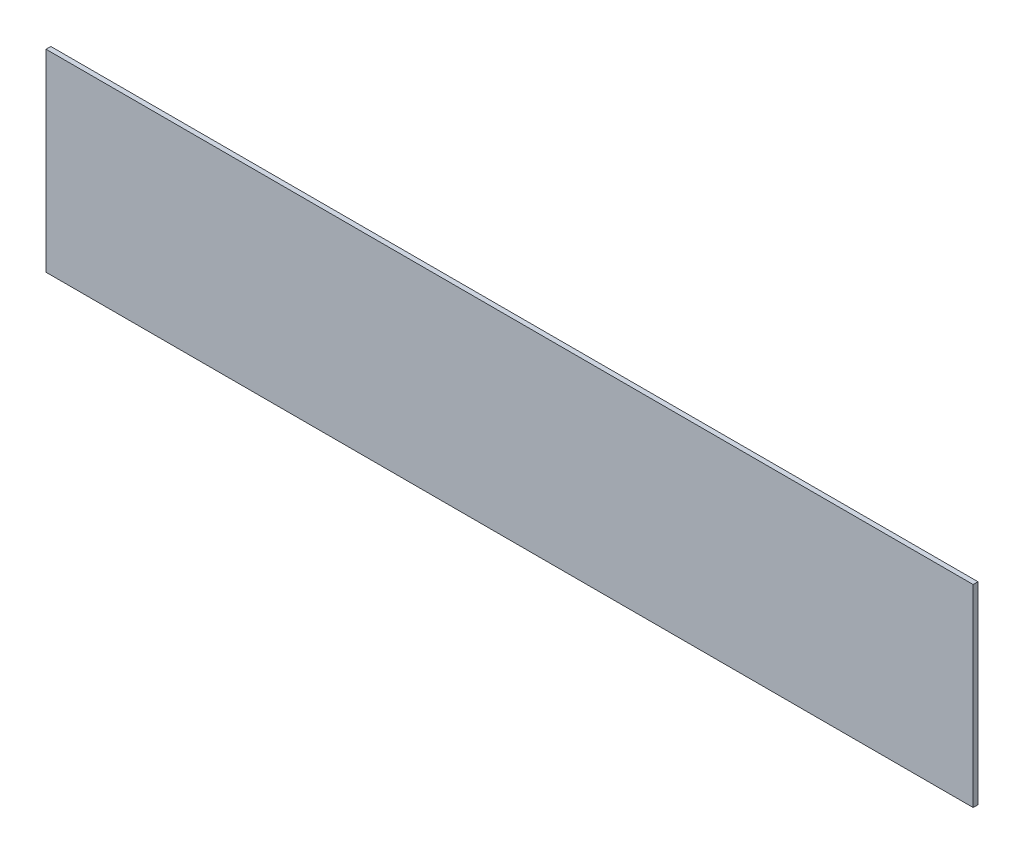
ISO-10303-21;
HEADER;
FILE_DESCRIPTION(('STEP AP214'),'2;1');
FILE_NAME('part.step','',(''),(''),'','','');
FILE_SCHEMA(('AUTOMOTIVE_DESIGN { 1 0 10303 214 1 1 1 1 }'));
ENDSEC;
DATA;
#1=APPLICATION_CONTEXT('core data for automotive mechanical design processes');
#2=APPLICATION_PROTOCOL_DEFINITION('international standard','automotive_design',2000,#1);
#3=PRODUCT_CONTEXT('',#1,'mechanical');
#4=PRODUCT('Part','Part','',(#3));
#5=PRODUCT_RELATED_PRODUCT_CATEGORY('part','',(#4));
#6=PRODUCT_DEFINITION_FORMATION('','',#4);
#7=PRODUCT_DEFINITION_CONTEXT('part definition',#1,'design');
#8=PRODUCT_DEFINITION('design','',#6,#7);
#9=PRODUCT_DEFINITION_SHAPE('','',#8);
#10=(LENGTH_UNIT() NAMED_UNIT(*) SI_UNIT(.MILLI.,.METRE.));
#11=(NAMED_UNIT(*) PLANE_ANGLE_UNIT() SI_UNIT($,.RADIAN.));
#12=(NAMED_UNIT(*) SI_UNIT($,.STERADIAN.) SOLID_ANGLE_UNIT());
#13=UNCERTAINTY_MEASURE_WITH_UNIT(LENGTH_MEASURE(1.E-05),#10,'distance_accuracy_value','');
#14=(GEOMETRIC_REPRESENTATION_CONTEXT(3) GLOBAL_UNCERTAINTY_ASSIGNED_CONTEXT((#13)) GLOBAL_UNIT_ASSIGNED_CONTEXT((#10,
#11,#12)) REPRESENTATION_CONTEXT('',''));
#15=CARTESIAN_POINT('',(0.,0.,0.));
#16=DIRECTION('',(0.,0.,1.));
#17=DIRECTION('',(1.,0.,0.));
#18=AXIS2_PLACEMENT_3D('',#15,#16,#17);
#19=CARTESIAN_POINT('',(0.,0.,12.7000000000002));
#20=DIRECTION('',(1.,0.,0.));
#21=DIRECTION('',(0.,0.,-1.));
#22=AXIS2_PLACEMENT_3D('',#19,#20,#21);
#23=PLANE('',#22);
#24=DIRECTION('',(0.,-1.,0.));
#25=VECTOR('',#24,1.);
#26=CARTESIAN_POINT('',(0.,0.,0.));
#27=LINE('',#26,#25);
#28=CARTESIAN_POINT('',(0.,508.,0.));
#29=VERTEX_POINT('',#28);
#30=CARTESIAN_POINT('',(0.,0.,0.));
#31=VERTEX_POINT('',#30);
#32=EDGE_CURVE('E92',#29,#31,#27,.T.);
#33=ORIENTED_EDGE('',*,*,#32,.T.);
#34=DIRECTION('',(0.,0.,-1.));
#35=VECTOR('',#34,1.);
#36=CARTESIAN_POINT('',(0.,0.,12.7000000000002));
#37=LINE('',#36,#35);
#38=CARTESIAN_POINT('',(0.,0.,12.7000000000002));
#39=VERTEX_POINT('',#38);
#40=EDGE_CURVE('E11',#39,#31,#37,.T.);
#41=ORIENTED_EDGE('',*,*,#40,.F.);
#42=DIRECTION('',(0.,-1.,0.));
#43=VECTOR('',#42,1.);
#44=CARTESIAN_POINT('',(0.,0.,12.7000000000002));
#45=LINE('',#44,#43);
#46=CARTESIAN_POINT('',(0.,508.,12.7000000000002));
#47=VERTEX_POINT('',#46);
#48=EDGE_CURVE('E80',#47,#39,#45,.T.);
#49=ORIENTED_EDGE('',*,*,#48,.F.);
#50=DIRECTION('',(0.,0.,-1.));
#51=VECTOR('',#50,1.);
#52=CARTESIAN_POINT('',(0.,508.,12.7000000000002));
#53=LINE('',#52,#51);
#54=EDGE_CURVE('E88',#47,#29,#53,.T.);
#55=ORIENTED_EDGE('',*,*,#54,.T.);
#56=EDGE_LOOP('',(#33,#41,#49,#55));
#57=FACE_BOUND('',#56,.T.);
#58=ADVANCED_FACE('F29',(#57),#23,.F.);
#59=CARTESIAN_POINT('',(0.,0.,12.7000000000002));
#60=DIRECTION('',(0.,1.,0.));
#61=DIRECTION('',(0.,0.,1.));
#62=AXIS2_PLACEMENT_3D('',#59,#60,#61);
#63=PLANE('',#62);
#64=DIRECTION('',(1.,0.,0.));
#65=VECTOR('',#64,1.);
#66=CARTESIAN_POINT('',(0.,0.,0.));
#67=LINE('',#66,#65);
#68=CARTESIAN_POINT('',(2438.4,0.,0.));
#69=VERTEX_POINT('',#68);
#70=EDGE_CURVE('E84',#31,#69,#67,.T.);
#71=ORIENTED_EDGE('',*,*,#70,.T.);
#72=DIRECTION('',(0.,0.,-1.));
#73=VECTOR('',#72,1.);
#74=CARTESIAN_POINT('',(2438.4,0.,12.7000000000002));
#75=LINE('',#74,#73);
#76=CARTESIAN_POINT('',(2438.4,0.,12.7000000000002));
#77=VERTEX_POINT('',#76);
#78=EDGE_CURVE('E37',#77,#69,#75,.T.);
#79=ORIENTED_EDGE('',*,*,#78,.F.);
#80=DIRECTION('',(1.,0.,0.));
#81=VECTOR('',#80,1.);
#82=CARTESIAN_POINT('',(0.,0.,12.7000000000002));
#83=LINE('',#82,#81);
#84=EDGE_CURVE('E75',#39,#77,#83,.T.);
#85=ORIENTED_EDGE('',*,*,#84,.F.);
#86=ORIENTED_EDGE('',*,*,#40,.T.);
#87=EDGE_LOOP('',(#71,#79,#85,#86));
#88=FACE_BOUND('',#87,.T.);
#89=ADVANCED_FACE('F83',(#88),#63,.F.);
#90=CARTESIAN_POINT('',(2438.4,0.,12.7000000000002));
#91=DIRECTION('',(-1.,0.,0.));
#92=DIRECTION('',(0.,0.,1.));
#93=AXIS2_PLACEMENT_3D('',#90,#91,#92);
#94=PLANE('',#93);
#95=DIRECTION('',(0.,1.,0.));
#96=VECTOR('',#95,1.);
#97=CARTESIAN_POINT('',(2438.4,0.,0.));
#98=LINE('',#97,#96);
#99=CARTESIAN_POINT('',(2438.4,508.,0.));
#100=VERTEX_POINT('',#99);
#101=EDGE_CURVE('E62',#69,#100,#98,.T.);
#102=ORIENTED_EDGE('',*,*,#101,.T.);
#103=DIRECTION('',(0.,0.,-1.));
#104=VECTOR('',#103,1.);
#105=CARTESIAN_POINT('',(2438.4,508.,12.7000000000002));
#106=LINE('',#105,#104);
#107=CARTESIAN_POINT('',(2438.4,508.,12.7000000000002));
#108=VERTEX_POINT('',#107);
#109=EDGE_CURVE('E85',#108,#100,#106,.T.);
#110=ORIENTED_EDGE('',*,*,#109,.F.);
#111=DIRECTION('',(0.,1.,0.));
#112=VECTOR('',#111,1.);
#113=CARTESIAN_POINT('',(2438.4,0.,12.7000000000002));
#114=LINE('',#113,#112);
#115=EDGE_CURVE('E78',#77,#108,#114,.T.);
#116=ORIENTED_EDGE('',*,*,#115,.F.);
#117=ORIENTED_EDGE('',*,*,#78,.T.);
#118=EDGE_LOOP('',(#102,#110,#116,#117));
#119=FACE_BOUND('',#118,.T.);
#120=ADVANCED_FACE('F86',(#119),#94,.F.);
#121=CARTESIAN_POINT('',(0.,508.,12.7000000000002));
#122=DIRECTION('',(0.,-1.,0.));
#123=DIRECTION('',(0.,0.,-1.));
#124=AXIS2_PLACEMENT_3D('',#121,#122,#123);
#125=PLANE('',#124);
#126=DIRECTION('',(-1.,0.,0.));
#127=VECTOR('',#126,1.);
#128=CARTESIAN_POINT('',(0.,508.,0.));
#129=LINE('',#128,#127);
#130=EDGE_CURVE('E68',#100,#29,#129,.T.);
#131=ORIENTED_EDGE('',*,*,#130,.T.);
#132=ORIENTED_EDGE('',*,*,#54,.F.);
#133=DIRECTION('',(-1.,0.,0.));
#134=VECTOR('',#133,1.);
#135=CARTESIAN_POINT('',(0.,508.,12.7000000000002));
#136=LINE('',#135,#134);
#137=EDGE_CURVE('E45',#108,#47,#136,.T.);
#138=ORIENTED_EDGE('',*,*,#137,.F.);
#139=ORIENTED_EDGE('',*,*,#109,.T.);
#140=EDGE_LOOP('',(#131,#132,#138,#139));
#141=FACE_BOUND('',#140,.T.);
#142=ADVANCED_FACE('F99',(#141),#125,.F.);
#143=CARTESIAN_POINT('',(0.,0.,12.7000000000002));
#144=DIRECTION('',(0.,0.,-1.));
#145=DIRECTION('',(-1.,0.,0.));
#146=AXIS2_PLACEMENT_3D('',#143,#144,#145);
#147=PLANE('',#146);
#148=ORIENTED_EDGE('',*,*,#48,.T.);
#149=ORIENTED_EDGE('',*,*,#84,.T.);
#150=ORIENTED_EDGE('',*,*,#115,.T.);
#151=ORIENTED_EDGE('',*,*,#137,.T.);
#152=EDGE_LOOP('',(#148,#149,#150,#151));
#153=FACE_BOUND('',#152,.T.);
#154=ADVANCED_FACE('F76',(#153),#147,.F.);
#155=CARTESIAN_POINT('',(0.,0.,0.));
#156=DIRECTION('',(0.,0.,-1.));
#157=DIRECTION('',(-1.,0.,0.));
#158=AXIS2_PLACEMENT_3D('',#155,#156,#157);
#159=PLANE('',#158);
#160=ORIENTED_EDGE('',*,*,#32,.F.);
#161=ORIENTED_EDGE('',*,*,#130,.F.);
#162=ORIENTED_EDGE('',*,*,#101,.F.);
#163=ORIENTED_EDGE('',*,*,#70,.F.);
#164=EDGE_LOOP('',(#160,#161,#162,#163));
#165=FACE_BOUND('',#164,.T.);
#166=ADVANCED_FACE('F102',(#165),#159,.T.);
#167=CLOSED_SHELL('',(#58,#89,#120,#142,#154,#166));
#168=MANIFOLD_SOLID_BREP('B2',#167);
#169=ADVANCED_BREP_SHAPE_REPRESENTATION('',(#18,#168),#14);
#170=SHAPE_DEFINITION_REPRESENTATION(#9,#169);
ENDSEC;
END-ISO-10303-21;
